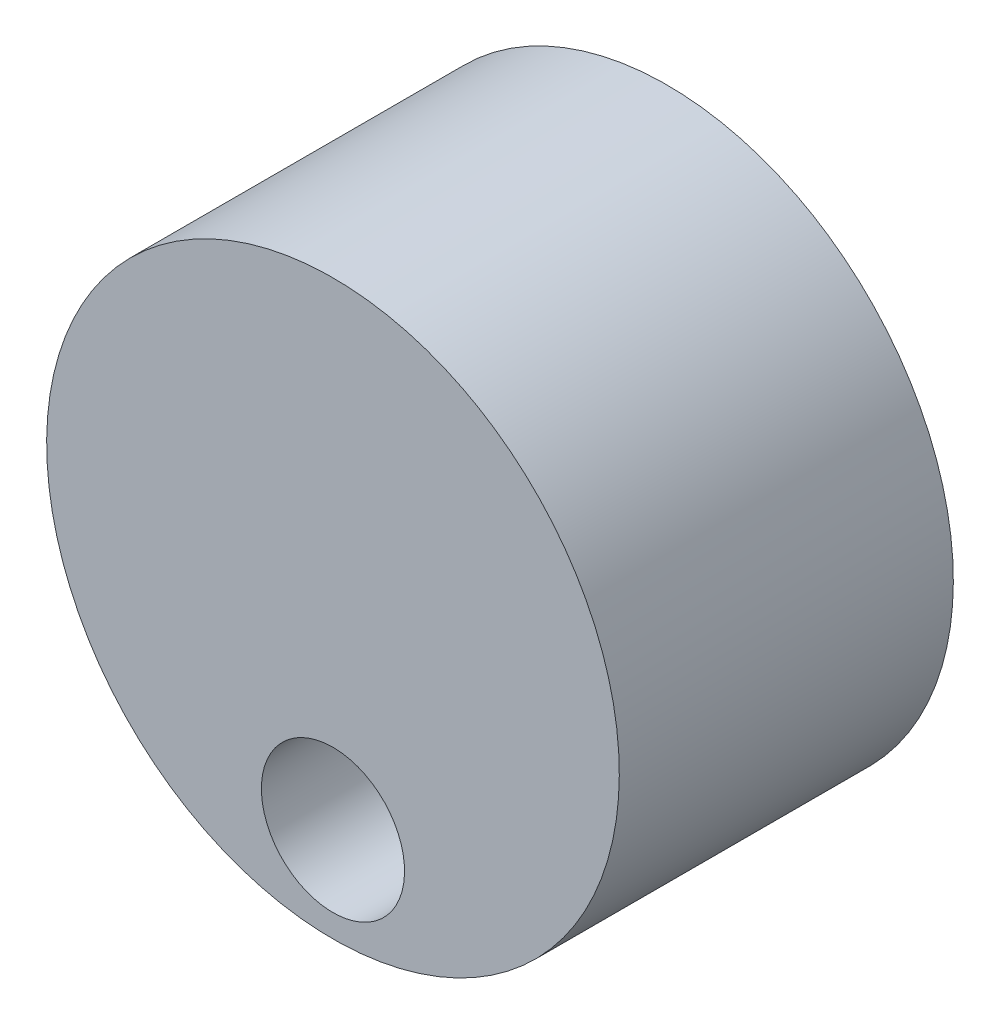
ISO-10303-21;
HEADER;
FILE_DESCRIPTION(('STEP AP214'),'2;1');
FILE_NAME('part.step','',(''),(''),'','','');
FILE_SCHEMA(('AUTOMOTIVE_DESIGN { 1 0 10303 214 1 1 1 1 }'));
ENDSEC;
DATA;
#1=APPLICATION_CONTEXT('core data for automotive mechanical design processes');
#2=APPLICATION_PROTOCOL_DEFINITION('international standard','automotive_design',2000,#1);
#3=PRODUCT_CONTEXT('',#1,'mechanical');
#4=PRODUCT('Part','Part','',(#3));
#5=PRODUCT_RELATED_PRODUCT_CATEGORY('part','',(#4));
#6=PRODUCT_DEFINITION_FORMATION('','',#4);
#7=PRODUCT_DEFINITION_CONTEXT('part definition',#1,'design');
#8=PRODUCT_DEFINITION('design','',#6,#7);
#9=PRODUCT_DEFINITION_SHAPE('','',#8);
#10=(LENGTH_UNIT() NAMED_UNIT(*) SI_UNIT(.MILLI.,.METRE.));
#11=(NAMED_UNIT(*) PLANE_ANGLE_UNIT() SI_UNIT($,.RADIAN.));
#12=(NAMED_UNIT(*) SI_UNIT($,.STERADIAN.) SOLID_ANGLE_UNIT());
#13=UNCERTAINTY_MEASURE_WITH_UNIT(LENGTH_MEASURE(1.E-05),#10,'distance_accuracy_value','');
#14=(GEOMETRIC_REPRESENTATION_CONTEXT(3) GLOBAL_UNCERTAINTY_ASSIGNED_CONTEXT((#13)) GLOBAL_UNIT_ASSIGNED_CONTEXT((#10,
#11,#12)) REPRESENTATION_CONTEXT('',''));
#15=CARTESIAN_POINT('',(0.,0.,0.));
#16=DIRECTION('',(0.,0.,1.));
#17=DIRECTION('',(1.,0.,0.));
#18=AXIS2_PLACEMENT_3D('',#15,#16,#17);
#19=CARTESIAN_POINT('',(0.,0.,14.81582));
#20=DIRECTION('',(0.,0.,1.));
#21=DIRECTION('',(1.,0.,0.));
#22=AXIS2_PLACEMENT_3D('',#19,#20,#21);
#23=PLANE('',#22);
#24=CARTESIAN_POINT('',(0.,0.,14.81582));
#25=DIRECTION('',(0.,0.,1.));
#26=DIRECTION('',(0.45338544026504,0.891314558702861,0.));
#27=AXIS2_PLACEMENT_3D('',#24,#25,#26);
#28=ELLIPSE('',#27,12.7,12.7);
#29=CARTESIAN_POINT('',(5.75799509136601,11.3196948955263,14.81582));
#30=VERTEX_POINT('',#29);
#31=EDGE_CURVE('E10',#30,#30,#28,.T.);
#32=ORIENTED_EDGE('',*,*,#31,.T.);
#33=EDGE_LOOP('',(#32));
#34=FACE_BOUND('',#33,.T.);
#35=CARTESIAN_POINT('',(0.,-8.509,14.81582));
#36=DIRECTION('',(0.,0.,1.));
#37=DIRECTION('',(-0.565173903661876,0.82497179262057,0.));
#38=AXIS2_PLACEMENT_3D('',#35,#36,#37);
#39=ELLIPSE('',#38,3.175,3.175);
#40=CARTESIAN_POINT('',(-1.79442714412646,-5.88971455842969,14.81582));
#41=VERTEX_POINT('',#40);
#42=EDGE_CURVE('E42',#41,#41,#39,.T.);
#43=ORIENTED_EDGE('',*,*,#42,.F.);
#44=EDGE_LOOP('',(#43));
#45=FACE_BOUND('',#44,.T.);
#46=ADVANCED_FACE('F31',(#34,#45),#23,.T.);
#47=CARTESIAN_POINT('',(0.,0.,0.));
#48=DIRECTION('',(0.,0.,1.));
#49=DIRECTION('',(1.,0.,0.));
#50=AXIS2_PLACEMENT_3D('',#47,#48,#49);
#51=PLANE('',#50);
#52=CARTESIAN_POINT('',(0.,0.,0.));
#53=DIRECTION('',(0.,0.,1.));
#54=DIRECTION('',(0.45338544026504,0.891314558702861,0.));
#55=AXIS2_PLACEMENT_3D('',#52,#53,#54);
#56=ELLIPSE('',#55,12.7,12.7);
#57=CARTESIAN_POINT('',(5.75799509136601,11.3196948955263,0.));
#58=VERTEX_POINT('',#57);
#59=EDGE_CURVE('E36',#58,#58,#56,.T.);
#60=ORIENTED_EDGE('',*,*,#59,.F.);
#61=EDGE_LOOP('',(#60));
#62=FACE_BOUND('',#61,.T.);
#63=CARTESIAN_POINT('',(0.,-8.509,0.));
#64=DIRECTION('',(0.,0.,1.));
#65=DIRECTION('',(-0.565173903661876,0.82497179262057,0.));
#66=AXIS2_PLACEMENT_3D('',#63,#64,#65);
#67=ELLIPSE('',#66,3.175,3.175);
#68=CARTESIAN_POINT('',(-1.79442714412646,-5.88971455842969,0.));
#69=VERTEX_POINT('',#68);
#70=EDGE_CURVE('E45',#69,#69,#67,.T.);
#71=ORIENTED_EDGE('',*,*,#70,.T.);
#72=EDGE_LOOP('',(#71));
#73=FACE_BOUND('',#72,.T.);
#74=ADVANCED_FACE('F56',(#62,#73),#51,.F.);
#75=DIRECTION('',(0.,0.,-1.));
#76=VECTOR('',#75,1.);
#77=SURFACE_OF_LINEAR_EXTRUSION('',#28,#76);
#78=ORIENTED_EDGE('',*,*,#31,.F.);
#79=EDGE_LOOP('',(#78));
#80=FACE_BOUND('',#79,.T.);
#81=ORIENTED_EDGE('',*,*,#59,.T.);
#82=EDGE_LOOP('',(#81));
#83=FACE_BOUND('',#82,.T.);
#84=ADVANCED_FACE('F33',(#80,#83),#77,.F.);
#85=DIRECTION('',(0.,0.,-1.));
#86=VECTOR('',#85,1.);
#87=SURFACE_OF_LINEAR_EXTRUSION('',#39,#86);
#88=ORIENTED_EDGE('',*,*,#42,.T.);
#89=EDGE_LOOP('',(#88));
#90=FACE_BOUND('',#89,.T.);
#91=ORIENTED_EDGE('',*,*,#70,.F.);
#92=EDGE_LOOP('',(#91));
#93=FACE_BOUND('',#92,.T.);
#94=ADVANCED_FACE('F51',(#90,#93),#87,.T.);
#95=CLOSED_SHELL('',(#46,#74,#84,#94));
#96=MANIFOLD_SOLID_BREP('B2',#95);
#97=ADVANCED_BREP_SHAPE_REPRESENTATION('',(#18,#96),#14);
#98=SHAPE_DEFINITION_REPRESENTATION(#9,#97);
ENDSEC;
END-ISO-10303-21;
